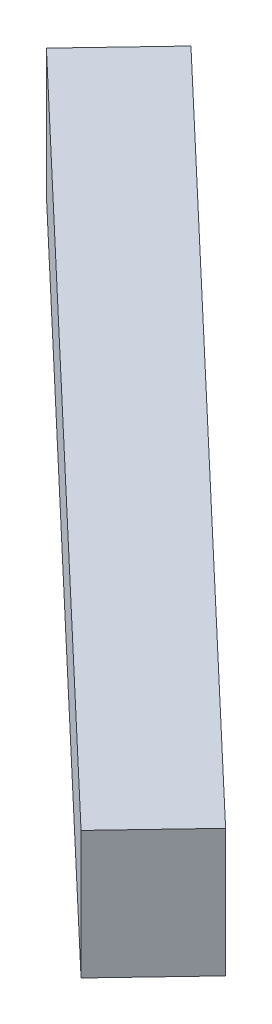
ISO-10303-21;
HEADER;
FILE_DESCRIPTION(('STEP AP214'),'2;1');
FILE_NAME('part.step','',(''),(''),'','','');
FILE_SCHEMA(('AUTOMOTIVE_DESIGN { 1 0 10303 214 1 1 1 1 }'));
ENDSEC;
DATA;
#1=APPLICATION_CONTEXT('core data for automotive mechanical design processes');
#2=APPLICATION_PROTOCOL_DEFINITION('international standard','automotive_design',2000,#1);
#3=PRODUCT_CONTEXT('',#1,'mechanical');
#4=PRODUCT('Part','Part','',(#3));
#5=PRODUCT_RELATED_PRODUCT_CATEGORY('part','',(#4));
#6=PRODUCT_DEFINITION_FORMATION('','',#4);
#7=PRODUCT_DEFINITION_CONTEXT('part definition',#1,'design');
#8=PRODUCT_DEFINITION('design','',#6,#7);
#9=PRODUCT_DEFINITION_SHAPE('','',#8);
#10=(LENGTH_UNIT() NAMED_UNIT(*) SI_UNIT(.MILLI.,.METRE.));
#11=(NAMED_UNIT(*) PLANE_ANGLE_UNIT() SI_UNIT($,.RADIAN.));
#12=(NAMED_UNIT(*) SI_UNIT($,.STERADIAN.) SOLID_ANGLE_UNIT());
#13=UNCERTAINTY_MEASURE_WITH_UNIT(LENGTH_MEASURE(1.E-05),#10,'distance_accuracy_value','');
#14=(GEOMETRIC_REPRESENTATION_CONTEXT(3) GLOBAL_UNCERTAINTY_ASSIGNED_CONTEXT((#13)) GLOBAL_UNIT_ASSIGNED_CONTEXT((#10,
#11,#12)) REPRESENTATION_CONTEXT('',''));
#15=CARTESIAN_POINT('',(0.,0.,0.));
#16=DIRECTION('',(0.,0.,1.));
#17=DIRECTION('',(1.,0.,0.));
#18=AXIS2_PLACEMENT_3D('',#15,#16,#17);
#19=CARTESIAN_POINT('',(13.1172677537318,7.874,12.3236726642255));
#20=DIRECTION('',(-0.688801770819254,0.,0.72494973654472));
#21=DIRECTION('',(0.72494973654472,0.,0.688801770819254));
#22=AXIS2_PLACEMENT_3D('',#19,#20,#21);
#23=PLANE('',#22);
#24=DIRECTION('',(0.,1.,0.));
#25=VECTOR('',#24,1.);
#26=CARTESIAN_POINT('',(13.1172677537318,7.874,12.3236726642255));
#27=LINE('',#26,#25);
#28=CARTESIAN_POINT('',(13.1172677537318,7.62,12.3236726642255));
#29=VERTEX_POINT('',#28);
#30=CARTESIAN_POINT('',(13.1172677537318,7.874,12.3236726642255));
#31=VERTEX_POINT('',#30);
#32=EDGE_CURVE('E20',#29,#31,#27,.T.);
#33=ORIENTED_EDGE('',*,*,#32,.T.);
#34=DIRECTION('',(0.724949736544692,0.,0.688801770819285));
#35=VECTOR('',#34,1.);
#36=CARTESIAN_POINT('',(13.1172677537318,7.874,12.3236726642255));
#37=LINE('',#36,#35);
#38=CARTESIAN_POINT('',(14.4982970018494,7.874,13.6358400376362));
#39=VERTEX_POINT('',#38);
#40=EDGE_CURVE('E55',#31,#39,#37,.T.);
#41=ORIENTED_EDGE('',*,*,#40,.T.);
#42=DIRECTION('',(0.,1.,0.));
#43=VECTOR('',#42,1.);
#44=CARTESIAN_POINT('',(14.4982970018494,7.874,13.6358400376362));
#45=LINE('',#44,#43);
#46=CARTESIAN_POINT('',(14.4982970018494,7.62,13.6358400376362));
#47=VERTEX_POINT('',#46);
#48=EDGE_CURVE('E76',#39,#47,#45,.F.);
#49=ORIENTED_EDGE('',*,*,#48,.T.);
#50=DIRECTION('',(0.724949736544692,0.,0.688801770819285));
#51=VECTOR('',#50,1.);
#52=CARTESIAN_POINT('',(13.1172677537318,7.62,12.3236726642255));
#53=LINE('',#52,#51);
#54=EDGE_CURVE('E58',#29,#47,#53,.T.);
#55=ORIENTED_EDGE('',*,*,#54,.F.);
#56=EDGE_LOOP('',(#33,#41,#49,#55));
#57=FACE_BOUND('',#56,.T.);
#58=ADVANCED_FACE('F17',(#57),#23,.F.);
#59=CARTESIAN_POINT('',(13.1172677537318,7.874,12.3236726642255));
#60=DIRECTION('',(0.724949736544773,0.,0.688801770819199));
#61=DIRECTION('',(0.688801770819199,0.,-0.724949736544773));
#62=AXIS2_PLACEMENT_3D('',#59,#60,#61);
#63=PLANE('',#62);
#64=DIRECTION('',(0.,1.,0.));
#65=VECTOR('',#64,1.);
#66=CARTESIAN_POINT('',(12.9773032339013,7.874,12.4709824506914));
#67=LINE('',#66,#65);
#68=CARTESIAN_POINT('',(12.9773032339013,7.62,12.4709824506914));
#69=VERTEX_POINT('',#68);
#70=CARTESIAN_POINT('',(12.9773032339013,7.874,12.4709824506914));
#71=VERTEX_POINT('',#70);
#72=EDGE_CURVE('E73',#69,#71,#67,.T.);
#73=ORIENTED_EDGE('',*,*,#72,.T.);
#74=DIRECTION('',(0.688801770819294,0.,-0.724949736544683));
#75=VECTOR('',#74,1.);
#76=CARTESIAN_POINT('',(12.9773032339013,7.874,12.4709824506914));
#77=LINE('',#76,#75);
#78=EDGE_CURVE('E63',#71,#31,#77,.T.);
#79=ORIENTED_EDGE('',*,*,#78,.T.);
#80=ORIENTED_EDGE('',*,*,#32,.F.);
#81=DIRECTION('',(0.688801770819294,0.,-0.724949736544683));
#82=VECTOR('',#81,1.);
#83=CARTESIAN_POINT('',(12.9773032339013,7.62,12.4709824506914));
#84=LINE('',#83,#82);
#85=EDGE_CURVE('E80',#69,#29,#84,.T.);
#86=ORIENTED_EDGE('',*,*,#85,.F.);
#87=EDGE_LOOP('',(#73,#79,#80,#86));
#88=FACE_BOUND('',#87,.T.);
#89=ADVANCED_FACE('F72',(#88),#63,.F.);
#90=CARTESIAN_POINT('',(13.1172677537318,7.874,12.3236726642255));
#91=DIRECTION('',(0.,-1.,0.));
#92=DIRECTION('',(0.,0.,-1.));
#93=AXIS2_PLACEMENT_3D('',#90,#91,#92);
#94=PLANE('',#93);
#95=ORIENTED_EDGE('',*,*,#78,.F.);
#96=DIRECTION('',(-0.724949736544721,0.,-0.688801770819254));
#97=VECTOR('',#96,1.);
#98=CARTESIAN_POINT('',(12.9773032339013,7.874,12.4709824506914));
#99=LINE('',#98,#97);
#100=CARTESIAN_POINT('',(14.3583324822432,7.874,13.7831498243151));
#101=VERTEX_POINT('',#100);
#102=EDGE_CURVE('E83',#71,#101,#99,.F.);
#103=ORIENTED_EDGE('',*,*,#102,.T.);
#104=DIRECTION('',(-0.688801769715632,0.,0.724949737593313));
#105=VECTOR('',#104,1.);
#106=CARTESIAN_POINT('',(14.4982970018494,7.874,13.6358400376362));
#107=LINE('',#106,#105);
#108=EDGE_CURVE('E69',#101,#39,#107,.F.);
#109=ORIENTED_EDGE('',*,*,#108,.T.);
#110=ORIENTED_EDGE('',*,*,#40,.F.);
#111=EDGE_LOOP('',(#95,#103,#109,#110));
#112=FACE_BOUND('',#111,.T.);
#113=ADVANCED_FACE('F66',(#112),#94,.F.);
#114=CARTESIAN_POINT('',(14.4982970018494,7.874,13.6358400376362));
#115=DIRECTION('',(-0.724949737593313,0.,-0.688801769715632));
#116=DIRECTION('',(-0.688801769715632,0.,0.724949737593313));
#117=AXIS2_PLACEMENT_3D('',#114,#115,#116);
#118=PLANE('',#117);
#119=ORIENTED_EDGE('',*,*,#48,.F.);
#120=ORIENTED_EDGE('',*,*,#108,.F.);
#121=DIRECTION('',(0.,1.,0.));
#122=VECTOR('',#121,1.);
#123=CARTESIAN_POINT('',(14.3583324822432,7.874,13.7831498243151));
#124=LINE('',#123,#122);
#125=CARTESIAN_POINT('',(14.3583324822432,7.62,13.7831498243151));
#126=VERTEX_POINT('',#125);
#127=EDGE_CURVE('E26',#101,#126,#124,.F.);
#128=ORIENTED_EDGE('',*,*,#127,.T.);
#129=DIRECTION('',(-0.688801769715732,0.,0.724949737593218));
#130=VECTOR('',#129,1.);
#131=CARTESIAN_POINT('',(14.4982970018494,7.62,13.6358400376362));
#132=LINE('',#131,#130);
#133=EDGE_CURVE('E34',#47,#126,#132,.T.);
#134=ORIENTED_EDGE('',*,*,#133,.F.);
#135=EDGE_LOOP('',(#119,#120,#128,#134));
#136=FACE_BOUND('',#135,.T.);
#137=ADVANCED_FACE('F88',(#136),#118,.F.);
#138=CARTESIAN_POINT('',(13.1172677537318,7.62,12.3236726642255));
#139=DIRECTION('',(0.,-1.,0.));
#140=DIRECTION('',(0.,0.,-1.));
#141=AXIS2_PLACEMENT_3D('',#138,#139,#140);
#142=PLANE('',#141);
#143=DIRECTION('',(-0.724949736544721,0.,-0.688801770819254));
#144=VECTOR('',#143,1.);
#145=CARTESIAN_POINT('',(12.9773032339013,7.62,12.4709824506914));
#146=LINE('',#145,#144);
#147=EDGE_CURVE('E11',#126,#69,#146,.T.);
#148=ORIENTED_EDGE('',*,*,#147,.T.);
#149=ORIENTED_EDGE('',*,*,#85,.T.);
#150=ORIENTED_EDGE('',*,*,#54,.T.);
#151=ORIENTED_EDGE('',*,*,#133,.T.);
#152=EDGE_LOOP('',(#148,#149,#150,#151));
#153=FACE_BOUND('',#152,.T.);
#154=ADVANCED_FACE('F91',(#153),#142,.T.);
#155=CARTESIAN_POINT('',(12.9773032339013,7.874,12.4709824506914));
#156=DIRECTION('',(0.688801770819254,0.,-0.724949736544721));
#157=DIRECTION('',(-0.724949736544721,0.,-0.688801770819254));
#158=AXIS2_PLACEMENT_3D('',#155,#156,#157);
#159=PLANE('',#158);
#160=ORIENTED_EDGE('',*,*,#127,.F.);
#161=ORIENTED_EDGE('',*,*,#102,.F.);
#162=ORIENTED_EDGE('',*,*,#72,.F.);
#163=ORIENTED_EDGE('',*,*,#147,.F.);
#164=EDGE_LOOP('',(#160,#161,#162,#163));
#165=FACE_BOUND('',#164,.T.);
#166=ADVANCED_FACE('F90',(#165),#159,.F.);
#167=CLOSED_SHELL('',(#58,#89,#113,#137,#154,#166));
#168=MANIFOLD_SOLID_BREP('B1',#167);
#169=ADVANCED_BREP_SHAPE_REPRESENTATION('',(#18,#168),#14);
#170=SHAPE_DEFINITION_REPRESENTATION(#9,#169);
ENDSEC;
END-ISO-10303-21;
